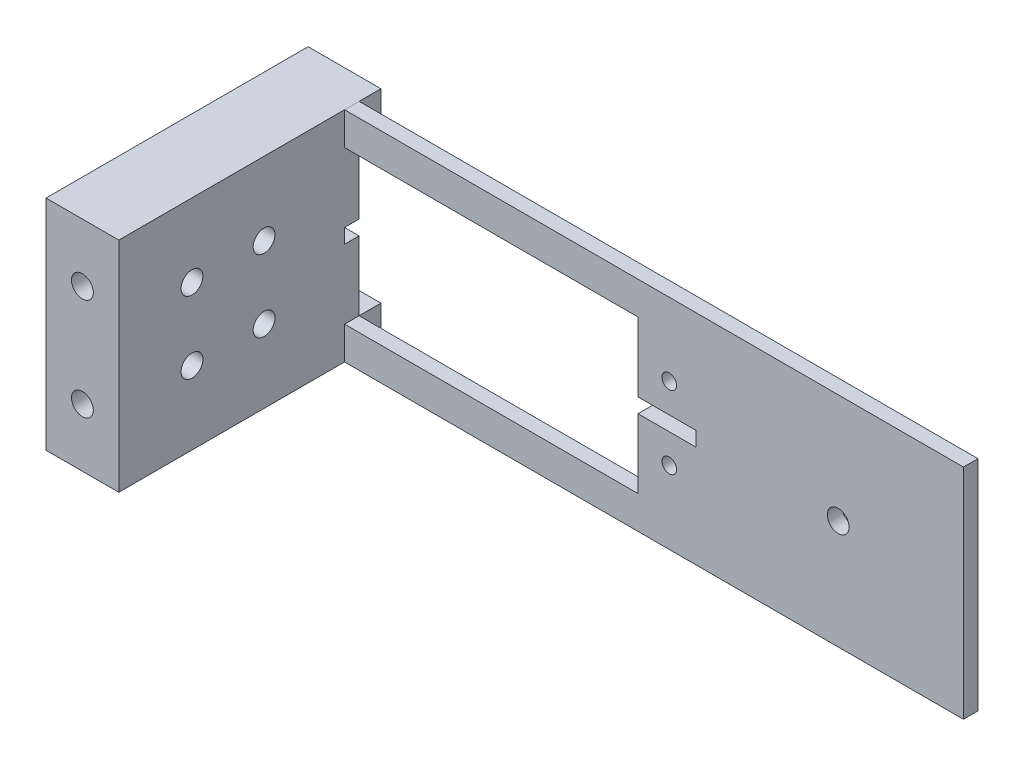
ISO-10303-21;
HEADER;
FILE_DESCRIPTION(('STEP AP214'),'2;1');
FILE_NAME('part.step','',(''),(''),'','','');
FILE_SCHEMA(('AUTOMOTIVE_DESIGN { 1 0 10303 214 1 1 1 1 }'));
ENDSEC;
DATA;
#1=APPLICATION_CONTEXT('core data for automotive mechanical design processes');
#2=APPLICATION_PROTOCOL_DEFINITION('international standard','automotive_design',2000,#1);
#3=PRODUCT_CONTEXT('',#1,'mechanical');
#4=PRODUCT('Part','Part','',(#3));
#5=PRODUCT_RELATED_PRODUCT_CATEGORY('part','',(#4));
#6=PRODUCT_DEFINITION_FORMATION('','',#4);
#7=PRODUCT_DEFINITION_CONTEXT('part definition',#1,'design');
#8=PRODUCT_DEFINITION('design','',#6,#7);
#9=PRODUCT_DEFINITION_SHAPE('','',#8);
#10=(LENGTH_UNIT() NAMED_UNIT(*) SI_UNIT(.MILLI.,.METRE.));
#11=(NAMED_UNIT(*) PLANE_ANGLE_UNIT() SI_UNIT($,.RADIAN.));
#12=(NAMED_UNIT(*) SI_UNIT($,.STERADIAN.) SOLID_ANGLE_UNIT());
#13=UNCERTAINTY_MEASURE_WITH_UNIT(LENGTH_MEASURE(1.E-05),#10,'distance_accuracy_value','');
#14=(GEOMETRIC_REPRESENTATION_CONTEXT(3) GLOBAL_UNCERTAINTY_ASSIGNED_CONTEXT((#13)) GLOBAL_UNIT_ASSIGNED_CONTEXT((#10,
#11,#12)) REPRESENTATION_CONTEXT('',''));
#15=CARTESIAN_POINT('',(0.,0.,0.));
#16=DIRECTION('',(0.,0.,1.));
#17=DIRECTION('',(1.,0.,0.));
#18=AXIS2_PLACEMENT_3D('',#15,#16,#17);
#19=CARTESIAN_POINT('',(10.,14.,-33.));
#20=DIRECTION('',(1.,0.,0.));
#21=DIRECTION('',(0.,0.,-1.));
#22=AXIS2_PLACEMENT_3D('',#19,#20,#21);
#23=PLANE('',#22);
#24=DIRECTION('',(0.,-1.,0.));
#25=VECTOR('',#24,1.);
#26=CARTESIAN_POINT('',(10.,4.5,-33.));
#27=LINE('',#26,#25);
#28=CARTESIAN_POINT('',(9.99999999999999,25.5,-33.));
#29=VERTEX_POINT('',#28);
#30=CARTESIAN_POINT('',(10.,16.,-33.));
#31=VERTEX_POINT('',#30);
#32=EDGE_CURVE('E143',#29,#31,#27,.T.);
#33=ORIENTED_EDGE('',*,*,#32,.F.);
#34=DIRECTION('',(0.,0.,-1.));
#35=VECTOR('',#34,1.);
#36=CARTESIAN_POINT('',(10.,25.5,-33.));
#37=LINE('',#36,#35);
#38=CARTESIAN_POINT('',(10.,25.5,-36.));
#39=VERTEX_POINT('',#38);
#40=EDGE_CURVE('E147',#29,#39,#37,.T.);
#41=ORIENTED_EDGE('',*,*,#40,.T.);
#42=DIRECTION('',(0.,-1.,0.));
#43=VECTOR('',#42,1.);
#44=CARTESIAN_POINT('',(10.,30.,-36.));
#45=LINE('',#44,#43);
#46=CARTESIAN_POINT('',(10.,30.,-36.));
#47=VERTEX_POINT('',#46);
#48=EDGE_CURVE('E229',#47,#39,#45,.T.);
#49=ORIENTED_EDGE('',*,*,#48,.F.);
#50=DIRECTION('',(0.,0.,-1.));
#51=VECTOR('',#50,1.);
#52=CARTESIAN_POINT('',(9.99999999999994,30.,0.));
#53=LINE('',#52,#51);
#54=CARTESIAN_POINT('',(10.,30.,0.));
#55=VERTEX_POINT('',#54);
#56=EDGE_CURVE('E261',#55,#47,#53,.T.);
#57=ORIENTED_EDGE('',*,*,#56,.F.);
#58=DIRECTION('',(0.,-1.,0.));
#59=VECTOR('',#58,1.);
#60=CARTESIAN_POINT('',(10.,30.,0.));
#61=LINE('',#60,#59);
#62=CARTESIAN_POINT('',(10.,0.,0.));
#63=VERTEX_POINT('',#62);
#64=EDGE_CURVE('E253',#55,#63,#61,.T.);
#65=ORIENTED_EDGE('',*,*,#64,.T.);
#66=DIRECTION('',(0.,0.,-1.));
#67=VECTOR('',#66,1.);
#68=CARTESIAN_POINT('',(9.99999999999994,0.,0.));
#69=LINE('',#68,#67);
#70=CARTESIAN_POINT('',(10.,0.,-36.));
#71=VERTEX_POINT('',#70);
#72=EDGE_CURVE('E246',#63,#71,#69,.T.);
#73=ORIENTED_EDGE('',*,*,#72,.T.);
#74=CARTESIAN_POINT('',(10.,4.5,-36.));
#75=VERTEX_POINT('',#74);
#76=EDGE_CURVE('E248',#75,#71,#45,.T.);
#77=ORIENTED_EDGE('',*,*,#76,.F.);
#78=DIRECTION('',(0.,0.,-1.));
#79=VECTOR('',#78,1.);
#80=CARTESIAN_POINT('',(10.,4.5,-33.));
#81=LINE('',#80,#79);
#82=CARTESIAN_POINT('',(10.,4.5,-33.));
#83=VERTEX_POINT('',#82);
#84=EDGE_CURVE('E171',#83,#75,#81,.T.);
#85=ORIENTED_EDGE('',*,*,#84,.F.);
#86=CARTESIAN_POINT('',(10.,14.,-33.));
#87=VERTEX_POINT('',#86);
#88=EDGE_CURVE('E154',#87,#83,#27,.T.);
#89=ORIENTED_EDGE('',*,*,#88,.F.);
#90=DIRECTION('',(0.,0.,1.));
#91=VECTOR('',#90,1.);
#92=CARTESIAN_POINT('',(10.,14.,0.));
#93=LINE('',#92,#91);
#94=CARTESIAN_POINT('',(10.,14.,-31.));
#95=VERTEX_POINT('',#94);
#96=EDGE_CURVE('E185',#87,#95,#93,.T.);
#97=ORIENTED_EDGE('',*,*,#96,.T.);
#98=DIRECTION('',(0.,-1.,0.));
#99=VECTOR('',#98,1.);
#100=CARTESIAN_POINT('',(10.,30.,-31.));
#101=LINE('',#100,#99);
#102=CARTESIAN_POINT('',(10.,16.,-31.));
#103=VERTEX_POINT('',#102);
#104=EDGE_CURVE('E183',#103,#95,#101,.T.);
#105=ORIENTED_EDGE('',*,*,#104,.F.);
#106=DIRECTION('',(0.,0.,-1.));
#107=VECTOR('',#106,1.);
#108=CARTESIAN_POINT('',(10.,16.,0.));
#109=LINE('',#108,#107);
#110=EDGE_CURVE('E150',#103,#31,#109,.T.);
#111=ORIENTED_EDGE('',*,*,#110,.T.);
#112=EDGE_LOOP('',(#33,#41,#49,#57,#65,#73,#77,#85,#89,#97,#105,#111));
#113=FACE_BOUND('',#112,.T.);
#114=CARTESIAN_POINT('',(10.,19.9497474683058,-10.0502525316942));
#115=DIRECTION('',(-1.,0.,0.));
#116=DIRECTION('',(0.,0.,1.));
#117=AXIS2_PLACEMENT_3D('',#114,#115,#116);
#118=CIRCLE('',#117,1.5);
#119=CARTESIAN_POINT('',(10.,19.9497474683058,-8.55025253169417));
#120=VERTEX_POINT('',#119);
#121=EDGE_CURVE('E232',#120,#120,#118,.T.);
#122=ORIENTED_EDGE('',*,*,#121,.T.);
#123=EDGE_LOOP('',(#122));
#124=FACE_BOUND('',#123,.T.);
#125=CARTESIAN_POINT('',(10.,10.0502525316942,-19.9497474683058));
#126=DIRECTION('',(-1.,0.,0.));
#127=DIRECTION('',(0.,0.,1.));
#128=AXIS2_PLACEMENT_3D('',#125,#126,#127);
#129=CIRCLE('',#128,1.5);
#130=CARTESIAN_POINT('',(10.,10.0502525316942,-18.4497474683058));
#131=VERTEX_POINT('',#130);
#132=EDGE_CURVE('E235',#131,#131,#129,.T.);
#133=ORIENTED_EDGE('',*,*,#132,.T.);
#134=EDGE_LOOP('',(#133));
#135=FACE_BOUND('',#134,.T.);
#136=CARTESIAN_POINT('',(10.,10.0502525316942,-10.0502525316942));
#137=DIRECTION('',(-1.,0.,0.));
#138=DIRECTION('',(0.,0.,1.));
#139=AXIS2_PLACEMENT_3D('',#136,#137,#138);
#140=CIRCLE('',#139,1.5);
#141=CARTESIAN_POINT('',(10.,10.0502525316942,-8.55025253169416));
#142=VERTEX_POINT('',#141);
#143=EDGE_CURVE('E239',#142,#142,#140,.T.);
#144=ORIENTED_EDGE('',*,*,#143,.T.);
#145=EDGE_LOOP('',(#144));
#146=FACE_BOUND('',#145,.T.);
#147=CARTESIAN_POINT('',(10.,19.9497474683058,-19.9497474683058));
#148=DIRECTION('',(-1.,0.,0.));
#149=DIRECTION('',(0.,0.,1.));
#150=AXIS2_PLACEMENT_3D('',#147,#148,#149);
#151=CIRCLE('',#150,1.5);
#152=CARTESIAN_POINT('',(10.,19.9497474683058,-18.4497474683058));
#153=VERTEX_POINT('',#152);
#154=EDGE_CURVE('E243',#153,#153,#151,.T.);
#155=ORIENTED_EDGE('',*,*,#154,.T.);
#156=EDGE_LOOP('',(#155));
#157=FACE_BOUND('',#156,.T.);
#158=ADVANCED_FACE('F49',(#113,#124,#135,#146,#157),#23,.T.);
#159=CARTESIAN_POINT('',(5.4,9.99999999999999,-29.));
#160=DIRECTION('',(0.,0.,-1.));
#161=DIRECTION('',(-1.,0.,0.));
#162=AXIS2_PLACEMENT_3D('',#159,#160,#161);
#163=PLANE('',#162);
#164=CARTESIAN_POINT('',(5.4,9.99999999999999,-29.));
#165=DIRECTION('',(0.,0.,-1.));
#166=DIRECTION('',(-1.,0.,0.));
#167=AXIS2_PLACEMENT_3D('',#164,#165,#166);
#168=CIRCLE('',#167,1.);
#169=CARTESIAN_POINT('',(4.4,9.99999999999999,-29.));
#170=VERTEX_POINT('',#169);
#171=EDGE_CURVE('E195',#170,#170,#168,.T.);
#172=ORIENTED_EDGE('',*,*,#171,.T.);
#173=EDGE_LOOP('',(#172));
#174=FACE_BOUND('',#173,.T.);
#175=ADVANCED_FACE('F329',(#174),#163,.T.);
#176=CARTESIAN_POINT('',(5.,22.,-4.));
#177=DIRECTION('',(0.,0.,1.));
#178=DIRECTION('',(1.,0.,0.));
#179=AXIS2_PLACEMENT_3D('',#176,#177,#178);
#180=PLANE('',#179);
#181=CARTESIAN_POINT('',(5.,22.,-4.));
#182=DIRECTION('',(0.,0.,1.));
#183=DIRECTION('',(1.,0.,0.));
#184=AXIS2_PLACEMENT_3D('',#181,#182,#183);
#185=CIRCLE('',#184,1.5);
#186=CARTESIAN_POINT('',(6.5,22.,-4.));
#187=VERTEX_POINT('',#186);
#188=EDGE_CURVE('E205',#187,#187,#185,.T.);
#189=ORIENTED_EDGE('',*,*,#188,.T.);
#190=EDGE_LOOP('',(#189));
#191=FACE_BOUND('',#190,.T.);
#192=ADVANCED_FACE('F331',(#191),#180,.T.);
#193=CARTESIAN_POINT('',(5.,8.,-4.));
#194=DIRECTION('',(0.,0.,1.));
#195=DIRECTION('',(1.,0.,0.));
#196=AXIS2_PLACEMENT_3D('',#193,#194,#195);
#197=PLANE('',#196);
#198=CARTESIAN_POINT('',(5.,8.,-4.));
#199=DIRECTION('',(0.,0.,1.));
#200=DIRECTION('',(1.,0.,0.));
#201=AXIS2_PLACEMENT_3D('',#198,#199,#200);
#202=CIRCLE('',#201,1.5);
#203=CARTESIAN_POINT('',(6.5,8.,-4.));
#204=VERTEX_POINT('',#203);
#205=EDGE_CURVE('E58',#204,#204,#202,.T.);
#206=ORIENTED_EDGE('',*,*,#205,.T.);
#207=EDGE_LOOP('',(#206));
#208=FACE_BOUND('',#207,.T.);
#209=ADVANCED_FACE('F338',(#208),#197,.T.);
#210=CARTESIAN_POINT('',(5.4,20.,-29.));
#211=DIRECTION('',(0.,0.,-1.));
#212=DIRECTION('',(-1.,0.,0.));
#213=AXIS2_PLACEMENT_3D('',#210,#211,#212);
#214=PLANE('',#213);
#215=CARTESIAN_POINT('',(5.4,20.,-29.));
#216=DIRECTION('',(0.,0.,-1.));
#217=DIRECTION('',(-1.,0.,0.));
#218=AXIS2_PLACEMENT_3D('',#215,#216,#217);
#219=CIRCLE('',#218,1.);
#220=CARTESIAN_POINT('',(4.4,20.,-29.));
#221=VERTEX_POINT('',#220);
#222=EDGE_CURVE('E199',#221,#221,#219,.T.);
#223=ORIENTED_EDGE('',*,*,#222,.T.);
#224=EDGE_LOOP('',(#223));
#225=FACE_BOUND('',#224,.T.);
#226=ADVANCED_FACE('F350',(#225),#214,.T.);
#227=CARTESIAN_POINT('',(5.4,9.99999999999999,-29.));
#228=DIRECTION('',(0.,0.,-1.));
#229=DIRECTION('',(-1.,0.,0.));
#230=AXIS2_PLACEMENT_3D('',#227,#228,#229);
#231=CYLINDRICAL_SURFACE('',#230,1.);
#232=ORIENTED_EDGE('',*,*,#171,.F.);
#233=EDGE_LOOP('',(#232));
#234=FACE_BOUND('',#233,.T.);
#235=CARTESIAN_POINT('',(5.4,9.99999999999999,-33.));
#236=DIRECTION('',(0.,0.,-1.));
#237=DIRECTION('',(-1.,0.,0.));
#238=AXIS2_PLACEMENT_3D('',#235,#236,#237);
#239=CIRCLE('',#238,1.);
#240=CARTESIAN_POINT('',(4.4,9.99999999999999,-33.));
#241=VERTEX_POINT('',#240);
#242=EDGE_CURVE('E196',#241,#241,#239,.T.);
#243=ORIENTED_EDGE('',*,*,#242,.T.);
#244=EDGE_LOOP('',(#243));
#245=FACE_BOUND('',#244,.T.);
#246=ADVANCED_FACE('F344',(#234,#245),#231,.F.);
#247=CARTESIAN_POINT('',(5.,22.,-4.));
#248=DIRECTION('',(0.,0.,1.));
#249=DIRECTION('',(1.,0.,0.));
#250=AXIS2_PLACEMENT_3D('',#247,#248,#249);
#251=CYLINDRICAL_SURFACE('',#250,1.5);
#252=ORIENTED_EDGE('',*,*,#188,.F.);
#253=EDGE_LOOP('',(#252));
#254=FACE_BOUND('',#253,.T.);
#255=CARTESIAN_POINT('',(5.,22.,0.));
#256=DIRECTION('',(0.,0.,1.));
#257=DIRECTION('',(1.,0.,0.));
#258=AXIS2_PLACEMENT_3D('',#255,#256,#257);
#259=CIRCLE('',#258,1.5);
#260=CARTESIAN_POINT('',(6.5,22.,0.));
#261=VERTEX_POINT('',#260);
#262=EDGE_CURVE('E208',#261,#261,#259,.T.);
#263=ORIENTED_EDGE('',*,*,#262,.T.);
#264=EDGE_LOOP('',(#263));
#265=FACE_BOUND('',#264,.T.);
#266=ADVANCED_FACE('F354',(#254,#265),#251,.F.);
#267=CARTESIAN_POINT('',(5.,8.,-4.));
#268=DIRECTION('',(0.,0.,1.));
#269=DIRECTION('',(1.,0.,0.));
#270=AXIS2_PLACEMENT_3D('',#267,#268,#269);
#271=CYLINDRICAL_SURFACE('',#270,1.5);
#272=ORIENTED_EDGE('',*,*,#205,.F.);
#273=EDGE_LOOP('',(#272));
#274=FACE_BOUND('',#273,.T.);
#275=CARTESIAN_POINT('',(5.,8.,0.));
#276=DIRECTION('',(0.,0.,1.));
#277=DIRECTION('',(1.,0.,0.));
#278=AXIS2_PLACEMENT_3D('',#275,#276,#277);
#279=CIRCLE('',#278,1.5);
#280=CARTESIAN_POINT('',(6.5,8.,0.));
#281=VERTEX_POINT('',#280);
#282=EDGE_CURVE('E13',#281,#281,#279,.T.);
#283=ORIENTED_EDGE('',*,*,#282,.T.);
#284=EDGE_LOOP('',(#283));
#285=FACE_BOUND('',#284,.T.);
#286=ADVANCED_FACE('F356',(#274,#285),#271,.F.);
#287=CARTESIAN_POINT('',(10.,25.5,-33.));
#288=DIRECTION('',(0.,1.,0.));
#289=DIRECTION('',(0.,0.,1.));
#290=AXIS2_PLACEMENT_3D('',#287,#288,#289);
#291=PLANE('',#290);
#292=DIRECTION('',(1.,0.,0.));
#293=VECTOR('',#292,1.);
#294=CARTESIAN_POINT('',(10.,25.5,-36.));
#295=LINE('',#294,#293);
#296=CARTESIAN_POINT('',(2.,25.5,-36.));
#297=VERTEX_POINT('',#296);
#298=EDGE_CURVE('E163',#297,#39,#295,.T.);
#299=ORIENTED_EDGE('',*,*,#298,.T.);
#300=ORIENTED_EDGE('',*,*,#40,.F.);
#301=DIRECTION('',(1.,0.,0.));
#302=VECTOR('',#301,1.);
#303=CARTESIAN_POINT('',(10.,25.5,-33.));
#304=LINE('',#303,#302);
#305=CARTESIAN_POINT('',(2.,25.5,-33.));
#306=VERTEX_POINT('',#305);
#307=EDGE_CURVE('E161',#306,#29,#304,.T.);
#308=ORIENTED_EDGE('',*,*,#307,.F.);
#309=DIRECTION('',(0.,0.,-1.));
#310=VECTOR('',#309,1.);
#311=CARTESIAN_POINT('',(2.,25.5,-33.));
#312=LINE('',#311,#310);
#313=EDGE_CURVE('E164',#306,#297,#312,.T.);
#314=ORIENTED_EDGE('',*,*,#313,.T.);
#315=EDGE_LOOP('',(#299,#300,#308,#314));
#316=FACE_BOUND('',#315,.T.);
#317=ADVANCED_FACE('F159',(#316),#291,.F.);
#318=CARTESIAN_POINT('',(5.4,20.,-29.));
#319=DIRECTION('',(0.,0.,-1.));
#320=DIRECTION('',(-1.,0.,0.));
#321=AXIS2_PLACEMENT_3D('',#318,#319,#320);
#322=CYLINDRICAL_SURFACE('',#321,1.);
#323=ORIENTED_EDGE('',*,*,#222,.F.);
#324=EDGE_LOOP('',(#323));
#325=FACE_BOUND('',#324,.T.);
#326=CARTESIAN_POINT('',(5.4,20.,-33.));
#327=DIRECTION('',(0.,0.,-1.));
#328=DIRECTION('',(-1.,0.,0.));
#329=AXIS2_PLACEMENT_3D('',#326,#327,#328);
#330=CIRCLE('',#329,1.);
#331=CARTESIAN_POINT('',(4.4,20.,-33.));
#332=VERTEX_POINT('',#331);
#333=EDGE_CURVE('E202',#332,#332,#330,.T.);
#334=ORIENTED_EDGE('',*,*,#333,.T.);
#335=EDGE_LOOP('',(#334));
#336=FACE_BOUND('',#335,.T.);
#337=ADVANCED_FACE('F346',(#325,#336),#322,.F.);
#338=CARTESIAN_POINT('',(0.,0.,-33.));
#339=DIRECTION('',(0.,0.,1.));
#340=DIRECTION('',(1.,0.,0.));
#341=AXIS2_PLACEMENT_3D('',#338,#339,#340);
#342=PLANE('',#341);
#343=ORIENTED_EDGE('',*,*,#242,.F.);
#344=EDGE_LOOP('',(#343));
#345=FACE_BOUND('',#344,.T.);
#346=DIRECTION('',(0.,1.,0.));
#347=VECTOR('',#346,1.);
#348=CARTESIAN_POINT('',(2.,4.5,-33.));
#349=LINE('',#348,#347);
#350=CARTESIAN_POINT('',(2.,4.5,-33.));
#351=VERTEX_POINT('',#350);
#352=CARTESIAN_POINT('',(2.,14.,-33.));
#353=VERTEX_POINT('',#352);
#354=EDGE_CURVE('E170',#351,#353,#349,.T.);
#355=ORIENTED_EDGE('',*,*,#354,.T.);
#356=DIRECTION('',(1.,0.,0.));
#357=VECTOR('',#356,1.);
#358=CARTESIAN_POINT('',(0.,14.,-33.));
#359=LINE('',#358,#357);
#360=EDGE_CURVE('E222',#353,#87,#359,.T.);
#361=ORIENTED_EDGE('',*,*,#360,.T.);
#362=ORIENTED_EDGE('',*,*,#88,.T.);
#363=DIRECTION('',(-1.,0.,0.));
#364=VECTOR('',#363,1.);
#365=CARTESIAN_POINT('',(10.,4.5,-33.));
#366=LINE('',#365,#364);
#367=EDGE_CURVE('E155',#83,#351,#366,.T.);
#368=ORIENTED_EDGE('',*,*,#367,.T.);
#369=EDGE_LOOP('',(#355,#361,#362,#368));
#370=FACE_BOUND('',#369,.T.);
#371=ADVANCED_FACE('F224',(#345,#370),#342,.F.);
#372=ORIENTED_EDGE('',*,*,#333,.F.);
#373=EDGE_LOOP('',(#372));
#374=FACE_BOUND('',#373,.T.);
#375=ORIENTED_EDGE('',*,*,#32,.T.);
#376=DIRECTION('',(-1.,0.,0.));
#377=VECTOR('',#376,1.);
#378=CARTESIAN_POINT('',(0.,16.,-33.));
#379=LINE('',#378,#377);
#380=CARTESIAN_POINT('',(2.,16.,-33.));
#381=VERTEX_POINT('',#380);
#382=EDGE_CURVE('E227',#31,#381,#379,.T.);
#383=ORIENTED_EDGE('',*,*,#382,.T.);
#384=EDGE_CURVE('E168',#381,#306,#349,.T.);
#385=ORIENTED_EDGE('',*,*,#384,.T.);
#386=ORIENTED_EDGE('',*,*,#307,.T.);
#387=EDGE_LOOP('',(#375,#383,#385,#386));
#388=FACE_BOUND('',#387,.T.);
#389=ADVANCED_FACE('F167',(#374,#388),#342,.F.);
#390=CARTESIAN_POINT('',(58.3,16.,-31.));
#391=DIRECTION('',(0.,1.,0.));
#392=DIRECTION('',(-1.,0.,0.));
#393=AXIS2_PLACEMENT_3D('',#390,#391,#392);
#394=PLANE('',#393);
#395=DIRECTION('',(1.,0.,0.));
#396=VECTOR('',#395,1.);
#397=CARTESIAN_POINT('',(58.3,16.,-31.));
#398=LINE('',#397,#396);
#399=CARTESIAN_POINT('',(2.,16.,-31.));
#400=VERTEX_POINT('',#399);
#401=EDGE_CURVE('E53',#400,#103,#398,.T.);
#402=ORIENTED_EDGE('',*,*,#401,.F.);
#403=DIRECTION('',(0.,0.,-1.));
#404=VECTOR('',#403,1.);
#405=CARTESIAN_POINT('',(2.,16.,-31.));
#406=LINE('',#405,#404);
#407=EDGE_CURVE('E66',#400,#381,#406,.T.);
#408=ORIENTED_EDGE('',*,*,#407,.T.);
#409=ORIENTED_EDGE('',*,*,#382,.F.);
#410=ORIENTED_EDGE('',*,*,#110,.F.);
#411=EDGE_LOOP('',(#402,#408,#409,#410));
#412=FACE_BOUND('',#411,.T.);
#413=ADVANCED_FACE('F51',(#412),#394,.F.);
#414=CARTESIAN_POINT('',(2.,4.5,-33.));
#415=DIRECTION('',(-1.,0.,0.));
#416=DIRECTION('',(0.,0.,1.));
#417=AXIS2_PLACEMENT_3D('',#414,#415,#416);
#418=PLANE('',#417);
#419=ORIENTED_EDGE('',*,*,#384,.F.);
#420=ORIENTED_EDGE('',*,*,#407,.F.);
#421=DIRECTION('',(0.,1.,0.));
#422=VECTOR('',#421,1.);
#423=CARTESIAN_POINT('',(2.,16.,-31.));
#424=LINE('',#423,#422);
#425=CARTESIAN_POINT('',(2.,14.,-31.));
#426=VERTEX_POINT('',#425);
#427=EDGE_CURVE('E193',#426,#400,#424,.T.);
#428=ORIENTED_EDGE('',*,*,#427,.F.);
#429=DIRECTION('',(0.,0.,-1.));
#430=VECTOR('',#429,1.);
#431=CARTESIAN_POINT('',(2.,14.,-31.));
#432=LINE('',#431,#430);
#433=EDGE_CURVE('E189',#426,#353,#432,.T.);
#434=ORIENTED_EDGE('',*,*,#433,.T.);
#435=ORIENTED_EDGE('',*,*,#354,.F.);
#436=DIRECTION('',(0.,0.,-1.));
#437=VECTOR('',#436,1.);
#438=CARTESIAN_POINT('',(2.,4.5,-33.));
#439=LINE('',#438,#437);
#440=CARTESIAN_POINT('',(2.,4.5,-36.));
#441=VERTEX_POINT('',#440);
#442=EDGE_CURVE('E175',#351,#441,#439,.T.);
#443=ORIENTED_EDGE('',*,*,#442,.T.);
#444=DIRECTION('',(0.,1.,0.));
#445=VECTOR('',#444,1.);
#446=CARTESIAN_POINT('',(2.,4.5,-36.));
#447=LINE('',#446,#445);
#448=EDGE_CURVE('E289',#441,#297,#447,.T.);
#449=ORIENTED_EDGE('',*,*,#448,.T.);
#450=ORIENTED_EDGE('',*,*,#313,.F.);
#451=EDGE_LOOP('',(#419,#420,#428,#434,#435,#443,#449,#450));
#452=FACE_BOUND('',#451,.T.);
#453=ADVANCED_FACE('F369',(#452),#418,.F.);
#454=CARTESIAN_POINT('',(58.3,14.,-31.));
#455=DIRECTION('',(0.,-1.,0.));
#456=DIRECTION('',(1.,0.,0.));
#457=AXIS2_PLACEMENT_3D('',#454,#455,#456);
#458=PLANE('',#457);
#459=ORIENTED_EDGE('',*,*,#360,.F.);
#460=ORIENTED_EDGE('',*,*,#433,.F.);
#461=DIRECTION('',(-1.,0.,0.));
#462=VECTOR('',#461,1.);
#463=CARTESIAN_POINT('',(58.3,14.,-31.));
#464=LINE('',#463,#462);
#465=EDGE_CURVE('E74',#95,#426,#464,.T.);
#466=ORIENTED_EDGE('',*,*,#465,.F.);
#467=ORIENTED_EDGE('',*,*,#96,.F.);
#468=EDGE_LOOP('',(#459,#460,#466,#467));
#469=FACE_BOUND('',#468,.T.);
#470=ADVANCED_FACE('F221',(#469),#458,.F.);
#471=CARTESIAN_POINT('',(0.,0.,-31.));
#472=DIRECTION('',(0.,0.,-1.));
#473=DIRECTION('',(-1.,0.,0.));
#474=AXIS2_PLACEMENT_3D('',#471,#472,#473);
#475=PLANE('',#474);
#476=ORIENTED_EDGE('',*,*,#104,.T.);
#477=ORIENTED_EDGE('',*,*,#465,.T.);
#478=ORIENTED_EDGE('',*,*,#427,.T.);
#479=ORIENTED_EDGE('',*,*,#401,.T.);
#480=EDGE_LOOP('',(#476,#477,#478,#479));
#481=FACE_BOUND('',#480,.T.);
#482=ADVANCED_FACE('F215',(#481),#475,.T.);
#483=CARTESIAN_POINT('',(0.,30.,-36.));
#484=DIRECTION('',(0.,0.,-1.));
#485=DIRECTION('',(-1.,0.,0.));
#486=AXIS2_PLACEMENT_3D('',#483,#484,#485);
#487=PLANE('',#486);
#488=ORIENTED_EDGE('',*,*,#298,.F.);
#489=ORIENTED_EDGE('',*,*,#448,.F.);
#490=DIRECTION('',(-1.,0.,0.));
#491=VECTOR('',#490,1.);
#492=CARTESIAN_POINT('',(10.,4.5,-36.));
#493=LINE('',#492,#491);
#494=EDGE_CURVE('E178',#75,#441,#493,.T.);
#495=ORIENTED_EDGE('',*,*,#494,.F.);
#496=ORIENTED_EDGE('',*,*,#76,.T.);
#497=DIRECTION('',(1.,0.,0.));
#498=VECTOR('',#497,1.);
#499=CARTESIAN_POINT('',(0.,0.,-36.));
#500=LINE('',#499,#498);
#501=CARTESIAN_POINT('',(0.,0.,-36.));
#502=VERTEX_POINT('',#501);
#503=EDGE_CURVE('E264',#502,#71,#500,.T.);
#504=ORIENTED_EDGE('',*,*,#503,.F.);
#505=DIRECTION('',(0.,-1.,0.));
#506=VECTOR('',#505,1.);
#507=CARTESIAN_POINT('',(0.,30.,-36.));
#508=LINE('',#507,#506);
#509=CARTESIAN_POINT('',(0.,30.,-36.));
#510=VERTEX_POINT('',#509);
#511=EDGE_CURVE('E249',#510,#502,#508,.T.);
#512=ORIENTED_EDGE('',*,*,#511,.F.);
#513=DIRECTION('',(1.,0.,0.));
#514=VECTOR('',#513,1.);
#515=CARTESIAN_POINT('',(0.,30.,-36.));
#516=LINE('',#515,#514);
#517=EDGE_CURVE('E274',#510,#47,#516,.T.);
#518=ORIENTED_EDGE('',*,*,#517,.T.);
#519=ORIENTED_EDGE('',*,*,#48,.T.);
#520=EDGE_LOOP('',(#488,#489,#495,#496,#504,#512,#518,#519));
#521=FACE_BOUND('',#520,.T.);
#522=ADVANCED_FACE('F297',(#521),#487,.T.);
#523=CARTESIAN_POINT('',(10.,4.5,-33.));
#524=DIRECTION('',(0.,-1.,0.));
#525=DIRECTION('',(0.,0.,-1.));
#526=AXIS2_PLACEMENT_3D('',#523,#524,#525);
#527=PLANE('',#526);
#528=ORIENTED_EDGE('',*,*,#494,.T.);
#529=ORIENTED_EDGE('',*,*,#442,.F.);
#530=ORIENTED_EDGE('',*,*,#367,.F.);
#531=ORIENTED_EDGE('',*,*,#84,.T.);
#532=EDGE_LOOP('',(#528,#529,#530,#531));
#533=FACE_BOUND('',#532,.T.);
#534=ADVANCED_FACE('F294',(#533),#527,.F.);
#535=CARTESIAN_POINT('',(0.,30.,0.));
#536=DIRECTION('',(-1.,0.,0.));
#537=DIRECTION('',(0.,0.,1.));
#538=AXIS2_PLACEMENT_3D('',#535,#536,#537);
#539=PLANE('',#538);
#540=CARTESIAN_POINT('',(0.,19.9497474683058,-10.0502525316942));
#541=DIRECTION('',(-1.,0.,0.));
#542=DIRECTION('',(0.,0.,1.));
#543=AXIS2_PLACEMENT_3D('',#540,#541,#542);
#544=CIRCLE('',#543,1.5);
#545=CARTESIAN_POINT('',(0.,19.9497474683058,-8.55025253169417));
#546=VERTEX_POINT('',#545);
#547=EDGE_CURVE('E242',#546,#546,#544,.T.);
#548=ORIENTED_EDGE('',*,*,#547,.F.);
#549=EDGE_LOOP('',(#548));
#550=FACE_BOUND('',#549,.T.);
#551=CARTESIAN_POINT('',(0.,10.0502525316942,-19.9497474683058));
#552=DIRECTION('',(-1.,0.,0.));
#553=DIRECTION('',(0.,0.,1.));
#554=AXIS2_PLACEMENT_3D('',#551,#552,#553);
#555=CIRCLE('',#554,1.5);
#556=CARTESIAN_POINT('',(0.,10.0502525316942,-18.4497474683058));
#557=VERTEX_POINT('',#556);
#558=EDGE_CURVE('E282',#557,#557,#555,.T.);
#559=ORIENTED_EDGE('',*,*,#558,.F.);
#560=EDGE_LOOP('',(#559));
#561=FACE_BOUND('',#560,.T.);
#562=CARTESIAN_POINT('',(0.,10.0502525316942,-10.0502525316942));
#563=DIRECTION('',(-1.,0.,0.));
#564=DIRECTION('',(0.,0.,1.));
#565=AXIS2_PLACEMENT_3D('',#562,#563,#564);
#566=CIRCLE('',#565,1.5);
#567=CARTESIAN_POINT('',(0.,10.0502525316942,-8.55025253169416));
#568=VERTEX_POINT('',#567);
#569=EDGE_CURVE('E165',#568,#568,#566,.T.);
#570=ORIENTED_EDGE('',*,*,#569,.F.);
#571=EDGE_LOOP('',(#570));
#572=FACE_BOUND('',#571,.T.);
#573=CARTESIAN_POINT('',(0.,19.9497474683058,-19.9497474683058));
#574=DIRECTION('',(-1.,0.,0.));
#575=DIRECTION('',(0.,0.,1.));
#576=AXIS2_PLACEMENT_3D('',#573,#574,#575);
#577=CIRCLE('',#576,1.5);
#578=CARTESIAN_POINT('',(0.,19.9497474683058,-18.4497474683058));
#579=VERTEX_POINT('',#578);
#580=EDGE_CURVE('E236',#579,#579,#577,.T.);
#581=ORIENTED_EDGE('',*,*,#580,.F.);
#582=EDGE_LOOP('',(#581));
#583=FACE_BOUND('',#582,.T.);
#584=DIRECTION('',(0.,0.,-1.));
#585=VECTOR('',#584,1.);
#586=CARTESIAN_POINT('',(0.,0.,0.));
#587=LINE('',#586,#585);
#588=CARTESIAN_POINT('',(0.,0.,0.));
#589=VERTEX_POINT('',#588);
#590=EDGE_CURVE('E260',#589,#502,#587,.T.);
#591=ORIENTED_EDGE('',*,*,#590,.F.);
#592=DIRECTION('',(0.,-1.,0.));
#593=VECTOR('',#592,1.);
#594=CARTESIAN_POINT('',(0.,30.,0.));
#595=LINE('',#594,#593);
#596=CARTESIAN_POINT('',(0.,30.,0.));
#597=VERTEX_POINT('',#596);
#598=EDGE_CURVE('E251',#597,#589,#595,.T.);
#599=ORIENTED_EDGE('',*,*,#598,.F.);
#600=DIRECTION('',(0.,0.,-1.));
#601=VECTOR('',#600,1.);
#602=CARTESIAN_POINT('',(0.,30.,0.));
#603=LINE('',#602,#601);
#604=EDGE_CURVE('E271',#597,#510,#603,.T.);
#605=ORIENTED_EDGE('',*,*,#604,.T.);
#606=ORIENTED_EDGE('',*,*,#511,.T.);
#607=EDGE_LOOP('',(#591,#599,#605,#606));
#608=FACE_BOUND('',#607,.T.);
#609=ADVANCED_FACE('F311',(#550,#561,#572,#583,#608),#539,.T.);
#610=CARTESIAN_POINT('',(95.,19.9497474683058,-10.0502525316942));
#611=DIRECTION('',(-1.,0.,0.));
#612=DIRECTION('',(0.,0.,1.));
#613=AXIS2_PLACEMENT_3D('',#610,#611,#612);
#614=CYLINDRICAL_SURFACE('',#613,1.5);
#615=ORIENTED_EDGE('',*,*,#547,.T.);
#616=EDGE_LOOP('',(#615));
#617=FACE_BOUND('',#616,.T.);
#618=ORIENTED_EDGE('',*,*,#121,.F.);
#619=EDGE_LOOP('',(#618));
#620=FACE_BOUND('',#619,.T.);
#621=ADVANCED_FACE('F314',(#617,#620),#614,.F.);
#622=CARTESIAN_POINT('',(95.,10.0502525316942,-19.9497474683058));
#623=DIRECTION('',(-1.,0.,0.));
#624=DIRECTION('',(0.,0.,1.));
#625=AXIS2_PLACEMENT_3D('',#622,#623,#624);
#626=CYLINDRICAL_SURFACE('',#625,1.5);
#627=ORIENTED_EDGE('',*,*,#558,.T.);
#628=EDGE_LOOP('',(#627));
#629=FACE_BOUND('',#628,.T.);
#630=ORIENTED_EDGE('',*,*,#132,.F.);
#631=EDGE_LOOP('',(#630));
#632=FACE_BOUND('',#631,.T.);
#633=ADVANCED_FACE('F321',(#629,#632),#626,.F.);
#634=CARTESIAN_POINT('',(95.,10.0502525316942,-10.0502525316942));
#635=DIRECTION('',(-1.,0.,0.));
#636=DIRECTION('',(0.,0.,1.));
#637=AXIS2_PLACEMENT_3D('',#634,#635,#636);
#638=CYLINDRICAL_SURFACE('',#637,1.5);
#639=ORIENTED_EDGE('',*,*,#569,.T.);
#640=EDGE_LOOP('',(#639));
#641=FACE_BOUND('',#640,.T.);
#642=ORIENTED_EDGE('',*,*,#143,.F.);
#643=EDGE_LOOP('',(#642));
#644=FACE_BOUND('',#643,.T.);
#645=ADVANCED_FACE('F477',(#641,#644),#638,.F.);
#646=CARTESIAN_POINT('',(95.,19.9497474683058,-19.9497474683058));
#647=DIRECTION('',(-1.,0.,0.));
#648=DIRECTION('',(0.,0.,1.));
#649=AXIS2_PLACEMENT_3D('',#646,#647,#648);
#650=CYLINDRICAL_SURFACE('',#649,1.5);
#651=ORIENTED_EDGE('',*,*,#580,.T.);
#652=EDGE_LOOP('',(#651));
#653=FACE_BOUND('',#652,.T.);
#654=ORIENTED_EDGE('',*,*,#154,.F.);
#655=EDGE_LOOP('',(#654));
#656=FACE_BOUND('',#655,.T.);
#657=ADVANCED_FACE('F487',(#653,#656),#650,.F.);
#658=CARTESIAN_POINT('',(0.,30.,0.));
#659=DIRECTION('',(0.,0.,-1.));
#660=DIRECTION('',(-1.,0.,0.));
#661=AXIS2_PLACEMENT_3D('',#658,#659,#660);
#662=PLANE('',#661);
#663=ORIENTED_EDGE('',*,*,#282,.F.);
#664=EDGE_LOOP('',(#663));
#665=FACE_BOUND('',#664,.T.);
#666=ORIENTED_EDGE('',*,*,#262,.F.);
#667=EDGE_LOOP('',(#666));
#668=FACE_BOUND('',#667,.T.);
#669=DIRECTION('',(1.,0.,0.));
#670=VECTOR('',#669,1.);
#671=CARTESIAN_POINT('',(0.,0.,0.));
#672=LINE('',#671,#670);
#673=EDGE_CURVE('E257',#589,#63,#672,.T.);
#674=ORIENTED_EDGE('',*,*,#673,.T.);
#675=ORIENTED_EDGE('',*,*,#64,.F.);
#676=DIRECTION('',(1.,0.,0.));
#677=VECTOR('',#676,1.);
#678=CARTESIAN_POINT('',(0.,30.,0.));
#679=LINE('',#678,#677);
#680=EDGE_CURVE('E256',#597,#55,#679,.T.);
#681=ORIENTED_EDGE('',*,*,#680,.F.);
#682=ORIENTED_EDGE('',*,*,#598,.T.);
#683=EDGE_LOOP('',(#674,#675,#681,#682));
#684=FACE_BOUND('',#683,.T.);
#685=ADVANCED_FACE('F305',(#665,#668,#684),#662,.F.);
#686=CARTESIAN_POINT('',(0.,0.,0.));
#687=DIRECTION('',(0.,1.,0.));
#688=DIRECTION('',(0.,0.,1.));
#689=AXIS2_PLACEMENT_3D('',#686,#687,#688);
#690=PLANE('',#689);
#691=ORIENTED_EDGE('',*,*,#72,.F.);
#692=ORIENTED_EDGE('',*,*,#673,.F.);
#693=ORIENTED_EDGE('',*,*,#590,.T.);
#694=ORIENTED_EDGE('',*,*,#503,.T.);
#695=EDGE_LOOP('',(#691,#692,#693,#694));
#696=FACE_BOUND('',#695,.T.);
#697=ADVANCED_FACE('F309',(#696),#690,.F.);
#698=CARTESIAN_POINT('',(0.,30.,0.));
#699=DIRECTION('',(0.,1.,0.));
#700=DIRECTION('',(0.,0.,1.));
#701=AXIS2_PLACEMENT_3D('',#698,#699,#700);
#702=PLANE('',#701);
#703=ORIENTED_EDGE('',*,*,#680,.T.);
#704=ORIENTED_EDGE('',*,*,#56,.T.);
#705=ORIENTED_EDGE('',*,*,#517,.F.);
#706=ORIENTED_EDGE('',*,*,#604,.F.);
#707=EDGE_LOOP('',(#703,#704,#705,#706));
#708=FACE_BOUND('',#707,.T.);
#709=ADVANCED_FACE('F303',(#708),#702,.T.);
#710=CLOSED_SHELL('',(#158,#175,#192,#209,#226,#246,#266,#286,#317,#337,#371,#389,#413,#453,
#470,#482,#522,#534,#609,#621,#633,#645,#657,#685,#697,#709));
#711=MANIFOLD_SOLID_BREP('B2',#710);
#712=CARTESIAN_POINT('',(10.,14.,-33.));
#713=DIRECTION('',(1.,0.,0.));
#714=DIRECTION('',(0.,0.,-1.));
#715=AXIS2_PLACEMENT_3D('',#712,#713,#714);
#716=PLANE('',#715);
#717=DIRECTION('',(0.,-1.,0.));
#718=VECTOR('',#717,1.);
#719=CARTESIAN_POINT('',(10.,30.,-31.));
#720=LINE('',#719,#718);
#721=CARTESIAN_POINT('',(10.,4.5,-31.));
#722=VERTEX_POINT('',#721);
#723=CARTESIAN_POINT('',(10.,0.,-31.));
#724=VERTEX_POINT('',#723);
#725=EDGE_CURVE('E780',#722,#724,#720,.T.);
#726=ORIENTED_EDGE('',*,*,#725,.F.);
#727=DIRECTION('',(0.,0.,-1.));
#728=VECTOR('',#727,1.);
#729=CARTESIAN_POINT('',(10.,4.5,0.));
#730=LINE('',#729,#728);
#731=CARTESIAN_POINT('',(10.,4.5,-33.));
#732=VERTEX_POINT('',#731);
#733=EDGE_CURVE('E47',#722,#732,#730,.T.);
#734=ORIENTED_EDGE('',*,*,#733,.T.);
#735=DIRECTION('',(0.,-1.,0.));
#736=VECTOR('',#735,1.);
#737=CARTESIAN_POINT('',(9.99999999999999,30.,-33.));
#738=LINE('',#737,#736);
#739=CARTESIAN_POINT('',(9.99999999999999,0.,-33.));
#740=VERTEX_POINT('',#739);
#741=EDGE_CURVE('E615',#732,#740,#738,.T.);
#742=ORIENTED_EDGE('',*,*,#741,.T.);
#743=DIRECTION('',(0.,0.,-1.));
#744=VECTOR('',#743,1.);
#745=CARTESIAN_POINT('',(10.,0.,0.));
#746=LINE('',#745,#744);
#747=EDGE_CURVE('E792',#724,#740,#746,.T.);
#748=ORIENTED_EDGE('',*,*,#747,.F.);
#749=EDGE_LOOP('',(#726,#734,#742,#748));
#750=FACE_BOUND('',#749,.T.);
#751=ADVANCED_FACE('F607',(#750),#716,.F.);
#752=DIRECTION('',(0.,0.,-1.));
#753=VECTOR('',#752,1.);
#754=CARTESIAN_POINT('',(10.,30.,0.));
#755=LINE('',#754,#753);
#756=CARTESIAN_POINT('',(10.,30.,-31.));
#757=VERTEX_POINT('',#756);
#758=CARTESIAN_POINT('',(9.99999999999999,30.,-33.));
#759=VERTEX_POINT('',#758);
#760=EDGE_CURVE('E610',#757,#759,#755,.T.);
#761=ORIENTED_EDGE('',*,*,#760,.T.);
#762=CARTESIAN_POINT('',(9.99999999999999,25.5,-33.));
#763=VERTEX_POINT('',#762);
#764=EDGE_CURVE('E785',#759,#763,#738,.T.);
#765=ORIENTED_EDGE('',*,*,#764,.T.);
#766=DIRECTION('',(0.,0.,-1.));
#767=VECTOR('',#766,1.);
#768=CARTESIAN_POINT('',(10.,25.5,0.));
#769=LINE('',#768,#767);
#770=CARTESIAN_POINT('',(10.,25.5,-31.));
#771=VERTEX_POINT('',#770);
#772=EDGE_CURVE('E743',#771,#763,#769,.T.);
#773=ORIENTED_EDGE('',*,*,#772,.F.);
#774=EDGE_CURVE('E781',#757,#771,#720,.T.);
#775=ORIENTED_EDGE('',*,*,#774,.F.);
#776=EDGE_LOOP('',(#761,#765,#773,#775));
#777=FACE_BOUND('',#776,.T.);
#778=ADVANCED_FACE('F807',(#777),#716,.F.);
#779=CARTESIAN_POINT('',(50.3,25.5,0.));
#780=DIRECTION('',(1.,0.,0.));
#781=DIRECTION('',(0.,0.,-1.));
#782=AXIS2_PLACEMENT_3D('',#779,#780,#781);
#783=PLANE('',#782);
#784=DIRECTION('',(0.,-1.,0.));
#785=VECTOR('',#784,1.);
#786=CARTESIAN_POINT('',(50.3,30.,-31.));
#787=LINE('',#786,#785);
#788=CARTESIAN_POINT('',(50.3,14.,-31.));
#789=VERTEX_POINT('',#788);
#790=CARTESIAN_POINT('',(50.3,4.5,-31.));
#791=VERTEX_POINT('',#790);
#792=EDGE_CURVE('E787',#789,#791,#787,.T.);
#793=ORIENTED_EDGE('',*,*,#792,.F.);
#794=DIRECTION('',(0.,0.,-1.));
#795=VECTOR('',#794,1.);
#796=CARTESIAN_POINT('',(50.3,14.,0.));
#797=LINE('',#796,#795);
#798=CARTESIAN_POINT('',(50.3,14.,-33.));
#799=VERTEX_POINT('',#798);
#800=EDGE_CURVE('E736',#789,#799,#797,.T.);
#801=ORIENTED_EDGE('',*,*,#800,.T.);
#802=DIRECTION('',(0.,1.,0.));
#803=VECTOR('',#802,1.);
#804=CARTESIAN_POINT('',(50.3,30.,-33.));
#805=LINE('',#804,#803);
#806=CARTESIAN_POINT('',(50.3,4.5,-33.));
#807=VERTEX_POINT('',#806);
#808=EDGE_CURVE('E756',#807,#799,#805,.T.);
#809=ORIENTED_EDGE('',*,*,#808,.F.);
#810=DIRECTION('',(0.,0.,-1.));
#811=VECTOR('',#810,1.);
#812=CARTESIAN_POINT('',(50.3,4.5,0.));
#813=LINE('',#812,#811);
#814=EDGE_CURVE('E745',#791,#807,#813,.T.);
#815=ORIENTED_EDGE('',*,*,#814,.F.);
#816=EDGE_LOOP('',(#793,#801,#809,#815));
#817=FACE_BOUND('',#816,.T.);
#818=ADVANCED_FACE('F833',(#817),#783,.F.);
#819=CARTESIAN_POINT('',(0.,30.,-33.));
#820=DIRECTION('',(0.,0.,1.));
#821=DIRECTION('',(1.,0.,0.));
#822=AXIS2_PLACEMENT_3D('',#819,#820,#821);
#823=PLANE('',#822);
#824=CARTESIAN_POINT('',(77.8,15.,-33.));
#825=DIRECTION('',(0.,0.,1.));
#826=DIRECTION('',(1.,0.,0.));
#827=AXIS2_PLACEMENT_3D('',#824,#825,#826);
#828=CIRCLE('',#827,1.5);
#829=CARTESIAN_POINT('',(79.3,15.,-33.));
#830=VERTEX_POINT('',#829);
#831=EDGE_CURVE('E798',#830,#830,#828,.T.);
#832=ORIENTED_EDGE('',*,*,#831,.T.);
#833=EDGE_LOOP('',(#832));
#834=FACE_BOUND('',#833,.T.);
#835=CARTESIAN_POINT('',(54.6,9.99999999999999,-33.));
#836=DIRECTION('',(0.,0.,-1.));
#837=DIRECTION('',(-1.,0.,0.));
#838=AXIS2_PLACEMENT_3D('',#835,#836,#837);
#839=CIRCLE('',#838,1.00000000000001);
#840=CARTESIAN_POINT('',(53.6,9.99999999999999,-33.));
#841=VERTEX_POINT('',#840);
#842=EDGE_CURVE('E794',#841,#841,#839,.T.);
#843=ORIENTED_EDGE('',*,*,#842,.F.);
#844=EDGE_LOOP('',(#843));
#845=FACE_BOUND('',#844,.T.);
#846=CARTESIAN_POINT('',(54.6,20.,-33.));
#847=DIRECTION('',(0.,0.,-1.));
#848=DIRECTION('',(-1.,0.,0.));
#849=AXIS2_PLACEMENT_3D('',#846,#847,#848);
#850=CIRCLE('',#849,0.999999999999998);
#851=CARTESIAN_POINT('',(53.6,20.,-33.));
#852=VERTEX_POINT('',#851);
#853=EDGE_CURVE('E728',#852,#852,#850,.T.);
#854=ORIENTED_EDGE('',*,*,#853,.F.);
#855=EDGE_LOOP('',(#854));
#856=FACE_BOUND('',#855,.T.);
#857=ORIENTED_EDGE('',*,*,#808,.T.);
#858=DIRECTION('',(1.,0.,0.));
#859=VECTOR('',#858,1.);
#860=CARTESIAN_POINT('',(0.,14.,-33.));
#861=LINE('',#860,#859);
#862=CARTESIAN_POINT('',(58.3,14.,-33.));
#863=VERTEX_POINT('',#862);
#864=EDGE_CURVE('E739',#799,#863,#861,.T.);
#865=ORIENTED_EDGE('',*,*,#864,.T.);
#866=DIRECTION('',(0.,1.,0.));
#867=VECTOR('',#866,1.);
#868=CARTESIAN_POINT('',(58.3,30.,-33.));
#869=LINE('',#868,#867);
#870=CARTESIAN_POINT('',(58.3,16.,-33.));
#871=VERTEX_POINT('',#870);
#872=EDGE_CURVE('E742',#863,#871,#869,.T.);
#873=ORIENTED_EDGE('',*,*,#872,.T.);
#874=DIRECTION('',(-1.,0.,0.));
#875=VECTOR('',#874,1.);
#876=CARTESIAN_POINT('',(0.,16.,-33.));
#877=LINE('',#876,#875);
#878=CARTESIAN_POINT('',(50.3,16.,-33.));
#879=VERTEX_POINT('',#878);
#880=EDGE_CURVE('E703',#871,#879,#877,.T.);
#881=ORIENTED_EDGE('',*,*,#880,.T.);
#882=CARTESIAN_POINT('',(50.3,25.5,-33.));
#883=VERTEX_POINT('',#882);
#884=EDGE_CURVE('E755',#879,#883,#805,.T.);
#885=ORIENTED_EDGE('',*,*,#884,.T.);
#886=DIRECTION('',(-1.,0.,0.));
#887=VECTOR('',#886,1.);
#888=CARTESIAN_POINT('',(0.,25.5,-33.));
#889=LINE('',#888,#887);
#890=EDGE_CURVE('E748',#883,#763,#889,.T.);
#891=ORIENTED_EDGE('',*,*,#890,.T.);
#892=ORIENTED_EDGE('',*,*,#764,.F.);
#893=DIRECTION('',(-1.,0.,0.));
#894=VECTOR('',#893,1.);
#895=CARTESIAN_POINT('',(0.,30.,-33.));
#896=LINE('',#895,#894);
#897=CARTESIAN_POINT('',(95.,30.,-33.));
#898=VERTEX_POINT('',#897);
#899=EDGE_CURVE('E762',#898,#759,#896,.T.);
#900=ORIENTED_EDGE('',*,*,#899,.F.);
#901=DIRECTION('',(0.,-1.,0.));
#902=VECTOR('',#901,1.);
#903=CARTESIAN_POINT('',(95.,30.,-33.));
#904=LINE('',#903,#902);
#905=CARTESIAN_POINT('',(95.,0.,-33.));
#906=VERTEX_POINT('',#905);
#907=EDGE_CURVE('E770',#898,#906,#904,.T.);
#908=ORIENTED_EDGE('',*,*,#907,.T.);
#909=DIRECTION('',(-1.,0.,0.));
#910=VECTOR('',#909,1.);
#911=CARTESIAN_POINT('',(0.,0.,-33.));
#912=LINE('',#911,#910);
#913=EDGE_CURVE('E761',#906,#740,#912,.T.);
#914=ORIENTED_EDGE('',*,*,#913,.T.);
#915=ORIENTED_EDGE('',*,*,#741,.F.);
#916=DIRECTION('',(1.,0.,0.));
#917=VECTOR('',#916,1.);
#918=CARTESIAN_POINT('',(0.,4.5,-33.));
#919=LINE('',#918,#917);
#920=EDGE_CURVE('E759',#732,#807,#919,.T.);
#921=ORIENTED_EDGE('',*,*,#920,.T.);
#922=EDGE_LOOP('',(#857,#865,#873,#881,#885,#891,#892,#900,#908,#914,#915,#921));
#923=FACE_BOUND('',#922,.T.);
#924=ADVANCED_FACE('F811',(#834,#845,#856,#923),#823,.F.);
#925=CARTESIAN_POINT('',(0.,30.,-31.));
#926=DIRECTION('',(0.,0.,-1.));
#927=DIRECTION('',(-1.,0.,0.));
#928=AXIS2_PLACEMENT_3D('',#925,#926,#927);
#929=PLANE('',#928);
#930=CARTESIAN_POINT('',(77.8,15.,-31.));
#931=DIRECTION('',(0.,0.,-1.));
#932=DIRECTION('',(-1.,0.,0.));
#933=AXIS2_PLACEMENT_3D('',#930,#931,#932);
#934=CIRCLE('',#933,1.5);
#935=CARTESIAN_POINT('',(76.3,15.,-31.));
#936=VERTEX_POINT('',#935);
#937=EDGE_CURVE('E796',#936,#936,#934,.T.);
#938=ORIENTED_EDGE('',*,*,#937,.T.);
#939=EDGE_LOOP('',(#938));
#940=FACE_BOUND('',#939,.T.);
#941=CARTESIAN_POINT('',(54.6,9.99999999999999,-31.));
#942=DIRECTION('',(0.,0.,-1.));
#943=DIRECTION('',(-1.,0.,0.));
#944=AXIS2_PLACEMENT_3D('',#941,#942,#943);
#945=CIRCLE('',#944,1.00000000000001);
#946=CARTESIAN_POINT('',(53.6,9.99999999999999,-31.));
#947=VERTEX_POINT('',#946);
#948=EDGE_CURVE('E722',#947,#947,#945,.T.);
#949=ORIENTED_EDGE('',*,*,#948,.T.);
#950=EDGE_LOOP('',(#949));
#951=FACE_BOUND('',#950,.T.);
#952=CARTESIAN_POINT('',(54.6,20.,-31.));
#953=DIRECTION('',(0.,0.,-1.));
#954=DIRECTION('',(-1.,0.,0.));
#955=AXIS2_PLACEMENT_3D('',#952,#953,#954);
#956=CIRCLE('',#955,0.999999999999998);
#957=CARTESIAN_POINT('',(53.6,20.,-31.));
#958=VERTEX_POINT('',#957);
#959=EDGE_CURVE('E725',#958,#958,#956,.T.);
#960=ORIENTED_EDGE('',*,*,#959,.T.);
#961=EDGE_LOOP('',(#960));
#962=FACE_BOUND('',#961,.T.);
#963=DIRECTION('',(0.,-1.,0.));
#964=VECTOR('',#963,1.);
#965=CARTESIAN_POINT('',(58.3,14.,-31.));
#966=LINE('',#965,#964);
#967=CARTESIAN_POINT('',(58.3,16.,-31.));
#968=VERTEX_POINT('',#967);
#969=CARTESIAN_POINT('',(58.3,14.,-31.));
#970=VERTEX_POINT('',#969);
#971=EDGE_CURVE('E710',#968,#970,#966,.T.);
#972=ORIENTED_EDGE('',*,*,#971,.T.);
#973=DIRECTION('',(-1.,0.,0.));
#974=VECTOR('',#973,1.);
#975=CARTESIAN_POINT('',(58.3,14.,-31.));
#976=LINE('',#975,#974);
#977=EDGE_CURVE('E707',#970,#789,#976,.T.);
#978=ORIENTED_EDGE('',*,*,#977,.T.);
#979=ORIENTED_EDGE('',*,*,#792,.T.);
#980=DIRECTION('',(-1.,0.,0.));
#981=VECTOR('',#980,1.);
#982=CARTESIAN_POINT('',(0.,4.5,-31.));
#983=LINE('',#982,#981);
#984=EDGE_CURVE('E789',#791,#722,#983,.T.);
#985=ORIENTED_EDGE('',*,*,#984,.T.);
#986=ORIENTED_EDGE('',*,*,#725,.T.);
#987=DIRECTION('',(1.,0.,0.));
#988=VECTOR('',#987,1.);
#989=CARTESIAN_POINT('',(0.,0.,-31.));
#990=LINE('',#989,#988);
#991=CARTESIAN_POINT('',(95.,0.,-31.));
#992=VERTEX_POINT('',#991);
#993=EDGE_CURVE('E772',#724,#992,#990,.T.);
#994=ORIENTED_EDGE('',*,*,#993,.T.);
#995=DIRECTION('',(0.,-1.,0.));
#996=VECTOR('',#995,1.);
#997=CARTESIAN_POINT('',(95.,30.,-31.));
#998=LINE('',#997,#996);
#999=CARTESIAN_POINT('',(95.,30.,-31.));
#1000=VERTEX_POINT('',#999);
#1001=EDGE_CURVE('E777',#1000,#992,#998,.T.);
#1002=ORIENTED_EDGE('',*,*,#1001,.F.);
#1003=DIRECTION('',(1.,0.,0.));
#1004=VECTOR('',#1003,1.);
#1005=CARTESIAN_POINT('',(0.,30.,-31.));
#1006=LINE('',#1005,#1004);
#1007=EDGE_CURVE('E765',#757,#1000,#1006,.T.);
#1008=ORIENTED_EDGE('',*,*,#1007,.F.);
#1009=ORIENTED_EDGE('',*,*,#774,.T.);
#1010=DIRECTION('',(1.,0.,0.));
#1011=VECTOR('',#1010,1.);
#1012=CARTESIAN_POINT('',(0.,25.5,-31.));
#1013=LINE('',#1012,#1011);
#1014=CARTESIAN_POINT('',(50.3,25.5,-31.));
#1015=VERTEX_POINT('',#1014);
#1016=EDGE_CURVE('E783',#771,#1015,#1013,.T.);
#1017=ORIENTED_EDGE('',*,*,#1016,.T.);
#1018=CARTESIAN_POINT('',(50.3,16.,-31.));
#1019=VERTEX_POINT('',#1018);
#1020=EDGE_CURVE('E721',#1015,#1019,#787,.T.);
#1021=ORIENTED_EDGE('',*,*,#1020,.T.);
#1022=DIRECTION('',(1.,0.,0.));
#1023=VECTOR('',#1022,1.);
#1024=CARTESIAN_POINT('',(58.3,16.,-31.));
#1025=LINE('',#1024,#1023);
#1026=EDGE_CURVE('E700',#1019,#968,#1025,.T.);
#1027=ORIENTED_EDGE('',*,*,#1026,.T.);
#1028=EDGE_LOOP('',(#972,#978,#979,#985,#986,#994,#1002,#1008,#1009,#1017,#1021,#1027));
#1029=FACE_BOUND('',#1028,.T.);
#1030=ADVANCED_FACE('F718',(#940,#951,#962,#1029),#929,.F.);
#1031=CARTESIAN_POINT('',(95.,30.,0.));
#1032=DIRECTION('',(-1.,0.,0.));
#1033=DIRECTION('',(0.,0.,1.));
#1034=AXIS2_PLACEMENT_3D('',#1031,#1032,#1033);
#1035=PLANE('',#1034);
#1036=DIRECTION('',(0.,0.,-1.));
#1037=VECTOR('',#1036,1.);
#1038=CARTESIAN_POINT('',(95.,0.,0.));
#1039=LINE('',#1038,#1037);
#1040=EDGE_CURVE('E766',#992,#906,#1039,.T.);
#1041=ORIENTED_EDGE('',*,*,#1040,.T.);
#1042=ORIENTED_EDGE('',*,*,#907,.F.);
#1043=DIRECTION('',(0.,0.,-1.));
#1044=VECTOR('',#1043,1.);
#1045=CARTESIAN_POINT('',(95.,30.,0.));
#1046=LINE('',#1045,#1044);
#1047=EDGE_CURVE('E768',#1000,#898,#1046,.T.);
#1048=ORIENTED_EDGE('',*,*,#1047,.F.);
#1049=ORIENTED_EDGE('',*,*,#1001,.T.);
#1050=EDGE_LOOP('',(#1041,#1042,#1048,#1049));
#1051=FACE_BOUND('',#1050,.T.);
#1052=ADVANCED_FACE('F826',(#1051),#1035,.F.);
#1053=CARTESIAN_POINT('',(0.,30.,0.));
#1054=DIRECTION('',(0.,1.,0.));
#1055=DIRECTION('',(0.,0.,1.));
#1056=AXIS2_PLACEMENT_3D('',#1053,#1054,#1055);
#1057=PLANE('',#1056);
#1058=ORIENTED_EDGE('',*,*,#760,.F.);
#1059=ORIENTED_EDGE('',*,*,#1007,.T.);
#1060=ORIENTED_EDGE('',*,*,#1047,.T.);
#1061=ORIENTED_EDGE('',*,*,#899,.T.);
#1062=EDGE_LOOP('',(#1058,#1059,#1060,#1061));
#1063=FACE_BOUND('',#1062,.T.);
#1064=ADVANCED_FACE('F820',(#1063),#1057,.T.);
#1065=CARTESIAN_POINT('',(0.,0.,0.));
#1066=DIRECTION('',(0.,1.,0.));
#1067=DIRECTION('',(0.,0.,1.));
#1068=AXIS2_PLACEMENT_3D('',#1065,#1066,#1067);
#1069=PLANE('',#1068);
#1070=ORIENTED_EDGE('',*,*,#993,.F.);
#1071=ORIENTED_EDGE('',*,*,#747,.T.);
#1072=ORIENTED_EDGE('',*,*,#913,.F.);
#1073=ORIENTED_EDGE('',*,*,#1040,.F.);
#1074=EDGE_LOOP('',(#1070,#1071,#1072,#1073));
#1075=FACE_BOUND('',#1074,.T.);
#1076=ADVANCED_FACE('F825',(#1075),#1069,.F.);
#1077=CARTESIAN_POINT('',(10.,4.5,0.));
#1078=DIRECTION('',(0.,-1.,0.));
#1079=DIRECTION('',(0.,0.,-1.));
#1080=AXIS2_PLACEMENT_3D('',#1077,#1078,#1079);
#1081=PLANE('',#1080);
#1082=ORIENTED_EDGE('',*,*,#733,.F.);
#1083=ORIENTED_EDGE('',*,*,#984,.F.);
#1084=ORIENTED_EDGE('',*,*,#814,.T.);
#1085=ORIENTED_EDGE('',*,*,#920,.F.);
#1086=EDGE_LOOP('',(#1082,#1083,#1084,#1085));
#1087=FACE_BOUND('',#1086,.T.);
#1088=ADVANCED_FACE('F829',(#1087),#1081,.F.);
#1089=ORIENTED_EDGE('',*,*,#884,.F.);
#1090=DIRECTION('',(0.,0.,1.));
#1091=VECTOR('',#1090,1.);
#1092=CARTESIAN_POINT('',(50.3,16.,0.));
#1093=LINE('',#1092,#1091);
#1094=EDGE_CURVE('E732',#879,#1019,#1093,.T.);
#1095=ORIENTED_EDGE('',*,*,#1094,.T.);
#1096=ORIENTED_EDGE('',*,*,#1020,.F.);
#1097=DIRECTION('',(0.,0.,-1.));
#1098=VECTOR('',#1097,1.);
#1099=CARTESIAN_POINT('',(50.3,25.5,0.));
#1100=LINE('',#1099,#1098);
#1101=EDGE_CURVE('E749',#1015,#883,#1100,.T.);
#1102=ORIENTED_EDGE('',*,*,#1101,.T.);
#1103=EDGE_LOOP('',(#1089,#1095,#1096,#1102));
#1104=FACE_BOUND('',#1103,.T.);
#1105=ADVANCED_FACE('F816',(#1104),#783,.F.);
#1106=CARTESIAN_POINT('',(10.,25.5,0.));
#1107=DIRECTION('',(0.,1.,0.));
#1108=DIRECTION('',(0.,0.,1.));
#1109=AXIS2_PLACEMENT_3D('',#1106,#1107,#1108);
#1110=PLANE('',#1109);
#1111=ORIENTED_EDGE('',*,*,#1101,.F.);
#1112=ORIENTED_EDGE('',*,*,#1016,.F.);
#1113=ORIENTED_EDGE('',*,*,#772,.T.);
#1114=ORIENTED_EDGE('',*,*,#890,.F.);
#1115=EDGE_LOOP('',(#1111,#1112,#1113,#1114));
#1116=FACE_BOUND('',#1115,.T.);
#1117=ADVANCED_FACE('F814',(#1116),#1110,.F.);
#1118=CARTESIAN_POINT('',(58.3,14.,-31.));
#1119=DIRECTION('',(1.,0.,0.));
#1120=DIRECTION('',(0.,0.,-1.));
#1121=AXIS2_PLACEMENT_3D('',#1118,#1119,#1120);
#1122=PLANE('',#1121);
#1123=DIRECTION('',(0.,0.,-1.));
#1124=VECTOR('',#1123,1.);
#1125=CARTESIAN_POINT('',(58.3,14.,-31.));
#1126=LINE('',#1125,#1124);
#1127=EDGE_CURVE('E706',#970,#863,#1126,.T.);
#1128=ORIENTED_EDGE('',*,*,#1127,.F.);
#1129=ORIENTED_EDGE('',*,*,#971,.F.);
#1130=DIRECTION('',(0.,0.,-1.));
#1131=VECTOR('',#1130,1.);
#1132=CARTESIAN_POINT('',(58.3,16.,-31.));
#1133=LINE('',#1132,#1131);
#1134=EDGE_CURVE('E696',#968,#871,#1133,.T.);
#1135=ORIENTED_EDGE('',*,*,#1134,.T.);
#1136=ORIENTED_EDGE('',*,*,#872,.F.);
#1137=EDGE_LOOP('',(#1128,#1129,#1135,#1136));
#1138=FACE_BOUND('',#1137,.T.);
#1139=ADVANCED_FACE('F711',(#1138),#1122,.F.);
#1140=CARTESIAN_POINT('',(58.3,14.,-31.));
#1141=DIRECTION('',(0.,-1.,0.));
#1142=DIRECTION('',(1.,0.,0.));
#1143=AXIS2_PLACEMENT_3D('',#1140,#1141,#1142);
#1144=PLANE('',#1143);
#1145=ORIENTED_EDGE('',*,*,#800,.F.);
#1146=ORIENTED_EDGE('',*,*,#977,.F.);
#1147=ORIENTED_EDGE('',*,*,#1127,.T.);
#1148=ORIENTED_EDGE('',*,*,#864,.F.);
#1149=EDGE_LOOP('',(#1145,#1146,#1147,#1148));
#1150=FACE_BOUND('',#1149,.T.);
#1151=ADVANCED_FACE('F835',(#1150),#1144,.F.);
#1152=CARTESIAN_POINT('',(58.3,16.,-31.));
#1153=DIRECTION('',(0.,1.,0.));
#1154=DIRECTION('',(-1.,0.,0.));
#1155=AXIS2_PLACEMENT_3D('',#1152,#1153,#1154);
#1156=PLANE('',#1155);
#1157=ORIENTED_EDGE('',*,*,#1134,.F.);
#1158=ORIENTED_EDGE('',*,*,#1026,.F.);
#1159=ORIENTED_EDGE('',*,*,#1094,.F.);
#1160=ORIENTED_EDGE('',*,*,#880,.F.);
#1161=EDGE_LOOP('',(#1157,#1158,#1159,#1160));
#1162=FACE_BOUND('',#1161,.T.);
#1163=ADVANCED_FACE('F698',(#1162),#1156,.F.);
#1164=CARTESIAN_POINT('',(54.6,20.,-29.));
#1165=DIRECTION('',(0.,0.,-1.));
#1166=DIRECTION('',(-1.,0.,0.));
#1167=AXIS2_PLACEMENT_3D('',#1164,#1165,#1166);
#1168=CYLINDRICAL_SURFACE('',#1167,0.999999999999998);
#1169=ORIENTED_EDGE('',*,*,#853,.T.);
#1170=EDGE_LOOP('',(#1169));
#1171=FACE_BOUND('',#1170,.T.);
#1172=ORIENTED_EDGE('',*,*,#959,.F.);
#1173=EDGE_LOOP('',(#1172));
#1174=FACE_BOUND('',#1173,.T.);
#1175=ADVANCED_FACE('F842',(#1171,#1174),#1168,.F.);
#1176=CARTESIAN_POINT('',(54.6,9.99999999999999,-29.));
#1177=DIRECTION('',(0.,0.,-1.));
#1178=DIRECTION('',(-1.,0.,0.));
#1179=AXIS2_PLACEMENT_3D('',#1176,#1177,#1178);
#1180=CYLINDRICAL_SURFACE('',#1179,1.00000000000001);
#1181=ORIENTED_EDGE('',*,*,#842,.T.);
#1182=EDGE_LOOP('',(#1181));
#1183=FACE_BOUND('',#1182,.T.);
#1184=ORIENTED_EDGE('',*,*,#948,.F.);
#1185=EDGE_LOOP('',(#1184));
#1186=FACE_BOUND('',#1185,.T.);
#1187=ADVANCED_FACE('F856',(#1183,#1186),#1180,.F.);
#1188=CARTESIAN_POINT('',(77.8,15.,0.));
#1189=DIRECTION('',(0.,0.,-1.));
#1190=DIRECTION('',(-1.,0.,0.));
#1191=AXIS2_PLACEMENT_3D('',#1188,#1189,#1190);
#1192=CYLINDRICAL_SURFACE('',#1191,1.5);
#1193=ORIENTED_EDGE('',*,*,#937,.F.);
#1194=EDGE_LOOP('',(#1193));
#1195=FACE_BOUND('',#1194,.T.);
#1196=ORIENTED_EDGE('',*,*,#831,.F.);
#1197=EDGE_LOOP('',(#1196));
#1198=FACE_BOUND('',#1197,.T.);
#1199=ADVANCED_FACE('F850',(#1195,#1198),#1192,.F.);
#1200=CLOSED_SHELL('',(#751,#778,#818,#924,#1030,#1052,#1064,#1076,#1088,#1105,#1117,#1139,
#1151,#1163,#1175,#1187,#1199));
#1201=MANIFOLD_SOLID_BREP('B7',#1200);
#1202=ADVANCED_BREP_SHAPE_REPRESENTATION('',(#18,#711,#1201),#14);
#1203=SHAPE_DEFINITION_REPRESENTATION(#9,#1202);
ENDSEC;
END-ISO-10303-21;
